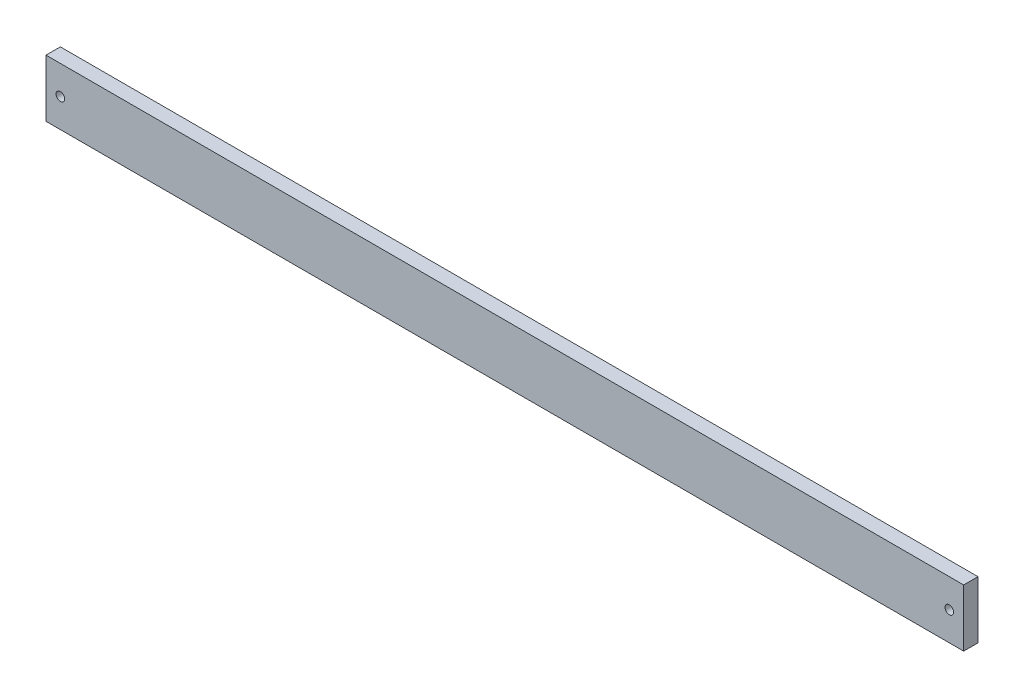
ISO-10303-21;
HEADER;
FILE_DESCRIPTION(('STEP AP214'),'2;1');
FILE_NAME('part.step','',(''),(''),'','','');
FILE_SCHEMA(('AUTOMOTIVE_DESIGN { 1 0 10303 214 1 1 1 1 }'));
ENDSEC;
DATA;
#1=APPLICATION_CONTEXT('core data for automotive mechanical design processes');
#2=APPLICATION_PROTOCOL_DEFINITION('international standard','automotive_design',2000,#1);
#3=PRODUCT_CONTEXT('',#1,'mechanical');
#4=PRODUCT('Part','Part','',(#3));
#5=PRODUCT_RELATED_PRODUCT_CATEGORY('part','',(#4));
#6=PRODUCT_DEFINITION_FORMATION('','',#4);
#7=PRODUCT_DEFINITION_CONTEXT('part definition',#1,'design');
#8=PRODUCT_DEFINITION('design','',#6,#7);
#9=PRODUCT_DEFINITION_SHAPE('','',#8);
#10=(LENGTH_UNIT() NAMED_UNIT(*) SI_UNIT(.MILLI.,.METRE.));
#11=(NAMED_UNIT(*) PLANE_ANGLE_UNIT() SI_UNIT($,.RADIAN.));
#12=(NAMED_UNIT(*) SI_UNIT($,.STERADIAN.) SOLID_ANGLE_UNIT());
#13=UNCERTAINTY_MEASURE_WITH_UNIT(LENGTH_MEASURE(1.E-05),#10,'distance_accuracy_value','');
#14=(GEOMETRIC_REPRESENTATION_CONTEXT(3) GLOBAL_UNCERTAINTY_ASSIGNED_CONTEXT((#13)) GLOBAL_UNIT_ASSIGNED_CONTEXT((#10,
#11,#12)) REPRESENTATION_CONTEXT('',''));
#15=CARTESIAN_POINT('',(0.,0.,0.));
#16=DIRECTION('',(0.,0.,1.));
#17=DIRECTION('',(1.,0.,0.));
#18=AXIS2_PLACEMENT_3D('',#15,#16,#17);
#19=CARTESIAN_POINT('',(-160.,-10.,5.));
#20=DIRECTION('',(1.,0.,0.));
#21=DIRECTION('',(0.,0.,-1.));
#22=AXIS2_PLACEMENT_3D('',#19,#20,#21);
#23=PLANE('',#22);
#24=DIRECTION('',(0.,-1.,0.));
#25=VECTOR('',#24,1.);
#26=CARTESIAN_POINT('',(-160.,-10.,0.));
#27=LINE('',#26,#25);
#28=CARTESIAN_POINT('',(-160.,9.99999999999998,0.));
#29=VERTEX_POINT('',#28);
#30=CARTESIAN_POINT('',(-160.,-10.,0.));
#31=VERTEX_POINT('',#30);
#32=EDGE_CURVE('E96',#29,#31,#27,.T.);
#33=ORIENTED_EDGE('',*,*,#32,.T.);
#34=DIRECTION('',(0.,0.,-1.));
#35=VECTOR('',#34,1.);
#36=CARTESIAN_POINT('',(-160.,-10.,5.));
#37=LINE('',#36,#35);
#38=CARTESIAN_POINT('',(-160.,-10.,5.));
#39=VERTEX_POINT('',#38);
#40=EDGE_CURVE('E11',#39,#31,#37,.T.);
#41=ORIENTED_EDGE('',*,*,#40,.F.);
#42=DIRECTION('',(0.,-1.,0.));
#43=VECTOR('',#42,1.);
#44=CARTESIAN_POINT('',(-160.,-10.,5.));
#45=LINE('',#44,#43);
#46=CARTESIAN_POINT('',(-160.,9.99999999999998,5.));
#47=VERTEX_POINT('',#46);
#48=EDGE_CURVE('E84',#47,#39,#45,.T.);
#49=ORIENTED_EDGE('',*,*,#48,.F.);
#50=DIRECTION('',(0.,0.,-1.));
#51=VECTOR('',#50,1.);
#52=CARTESIAN_POINT('',(-160.,9.99999999999998,5.));
#53=LINE('',#52,#51);
#54=EDGE_CURVE('E92',#47,#29,#53,.T.);
#55=ORIENTED_EDGE('',*,*,#54,.T.);
#56=EDGE_LOOP('',(#33,#41,#49,#55));
#57=FACE_BOUND('',#56,.T.);
#58=ADVANCED_FACE('F33',(#57),#23,.F.);
#59=CARTESIAN_POINT('',(160.,-9.99999999999998,5.));
#60=DIRECTION('',(0.,1.,0.));
#61=DIRECTION('',(-1.,0.,0.));
#62=AXIS2_PLACEMENT_3D('',#59,#60,#61);
#63=PLANE('',#62);
#64=DIRECTION('',(1.,0.,0.));
#65=VECTOR('',#64,1.);
#66=CARTESIAN_POINT('',(160.,-9.99999999999998,0.));
#67=LINE('',#66,#65);
#68=CARTESIAN_POINT('',(160.,-9.99999999999998,0.));
#69=VERTEX_POINT('',#68);
#70=EDGE_CURVE('E88',#31,#69,#67,.T.);
#71=ORIENTED_EDGE('',*,*,#70,.T.);
#72=DIRECTION('',(0.,0.,-1.));
#73=VECTOR('',#72,1.);
#74=CARTESIAN_POINT('',(160.,-9.99999999999998,5.));
#75=LINE('',#74,#73);
#76=CARTESIAN_POINT('',(160.,-9.99999999999998,5.));
#77=VERTEX_POINT('',#76);
#78=EDGE_CURVE('E41',#77,#69,#75,.T.);
#79=ORIENTED_EDGE('',*,*,#78,.F.);
#80=DIRECTION('',(1.,0.,0.));
#81=VECTOR('',#80,1.);
#82=CARTESIAN_POINT('',(160.,-9.99999999999998,5.));
#83=LINE('',#82,#81);
#84=EDGE_CURVE('E79',#39,#77,#83,.T.);
#85=ORIENTED_EDGE('',*,*,#84,.F.);
#86=ORIENTED_EDGE('',*,*,#40,.T.);
#87=EDGE_LOOP('',(#71,#79,#85,#86));
#88=FACE_BOUND('',#87,.T.);
#89=ADVANCED_FACE('F87',(#88),#63,.F.);
#90=CARTESIAN_POINT('',(160.,-9.99999999999998,5.));
#91=DIRECTION('',(-1.,0.,0.));
#92=DIRECTION('',(0.,0.,1.));
#93=AXIS2_PLACEMENT_3D('',#90,#91,#92);
#94=PLANE('',#93);
#95=DIRECTION('',(0.,1.,0.));
#96=VECTOR('',#95,1.);
#97=CARTESIAN_POINT('',(160.,-9.99999999999998,0.));
#98=LINE('',#97,#96);
#99=CARTESIAN_POINT('',(160.,10.,0.));
#100=VERTEX_POINT('',#99);
#101=EDGE_CURVE('E66',#69,#100,#98,.T.);
#102=ORIENTED_EDGE('',*,*,#101,.T.);
#103=DIRECTION('',(0.,0.,-1.));
#104=VECTOR('',#103,1.);
#105=CARTESIAN_POINT('',(160.,10.,5.));
#106=LINE('',#105,#104);
#107=CARTESIAN_POINT('',(160.,10.,5.));
#108=VERTEX_POINT('',#107);
#109=EDGE_CURVE('E89',#108,#100,#106,.T.);
#110=ORIENTED_EDGE('',*,*,#109,.F.);
#111=DIRECTION('',(0.,1.,0.));
#112=VECTOR('',#111,1.);
#113=CARTESIAN_POINT('',(160.,-9.99999999999998,5.));
#114=LINE('',#113,#112);
#115=EDGE_CURVE('E82',#77,#108,#114,.T.);
#116=ORIENTED_EDGE('',*,*,#115,.F.);
#117=ORIENTED_EDGE('',*,*,#78,.T.);
#118=EDGE_LOOP('',(#102,#110,#116,#117));
#119=FACE_BOUND('',#118,.T.);
#120=ADVANCED_FACE('F90',(#119),#94,.F.);
#121=CARTESIAN_POINT('',(160.,10.,5.));
#122=DIRECTION('',(0.,-1.,0.));
#123=DIRECTION('',(1.,0.,0.));
#124=AXIS2_PLACEMENT_3D('',#121,#122,#123);
#125=PLANE('',#124);
#126=DIRECTION('',(-1.,0.,0.));
#127=VECTOR('',#126,1.);
#128=CARTESIAN_POINT('',(160.,10.,0.));
#129=LINE('',#128,#127);
#130=EDGE_CURVE('E72',#100,#29,#129,.T.);
#131=ORIENTED_EDGE('',*,*,#130,.T.);
#132=ORIENTED_EDGE('',*,*,#54,.F.);
#133=DIRECTION('',(-1.,0.,0.));
#134=VECTOR('',#133,1.);
#135=CARTESIAN_POINT('',(160.,10.,5.));
#136=LINE('',#135,#134);
#137=EDGE_CURVE('E49',#108,#47,#136,.T.);
#138=ORIENTED_EDGE('',*,*,#137,.F.);
#139=ORIENTED_EDGE('',*,*,#109,.T.);
#140=EDGE_LOOP('',(#131,#132,#138,#139));
#141=FACE_BOUND('',#140,.T.);
#142=ADVANCED_FACE('F104',(#141),#125,.F.);
#143=CARTESIAN_POINT('',(0.,0.,5.));
#144=DIRECTION('',(0.,0.,1.));
#145=DIRECTION('',(1.,0.,0.));
#146=AXIS2_PLACEMENT_3D('',#143,#144,#145);
#147=PLANE('',#146);
#148=CARTESIAN_POINT('',(155.,0.,5.));
#149=DIRECTION('',(0.,0.,1.));
#150=DIRECTION('',(-1.,0.,0.));
#151=AXIS2_PLACEMENT_3D('',#148,#149,#150);
#152=CIRCLE('',#151,1.50000000000124);
#153=CARTESIAN_POINT('',(153.499999999999,0.,5.));
#154=VERTEX_POINT('',#153);
#155=EDGE_CURVE('E116',#154,#154,#152,.T.);
#156=ORIENTED_EDGE('',*,*,#155,.F.);
#157=EDGE_LOOP('',(#156));
#158=FACE_BOUND('',#157,.T.);
#159=CARTESIAN_POINT('',(-155.,0.,5.));
#160=DIRECTION('',(0.,0.,1.));
#161=DIRECTION('',(1.,0.,0.));
#162=AXIS2_PLACEMENT_3D('',#159,#160,#161);
#163=CIRCLE('',#162,1.5);
#164=CARTESIAN_POINT('',(-153.5,0.,5.));
#165=VERTEX_POINT('',#164);
#166=EDGE_CURVE('E110',#165,#165,#163,.T.);
#167=ORIENTED_EDGE('',*,*,#166,.F.);
#168=EDGE_LOOP('',(#167));
#169=FACE_BOUND('',#168,.T.);
#170=ORIENTED_EDGE('',*,*,#48,.T.);
#171=ORIENTED_EDGE('',*,*,#84,.T.);
#172=ORIENTED_EDGE('',*,*,#115,.T.);
#173=ORIENTED_EDGE('',*,*,#137,.T.);
#174=EDGE_LOOP('',(#170,#171,#172,#173));
#175=FACE_BOUND('',#174,.T.);
#176=ADVANCED_FACE('F80',(#158,#169,#175),#147,.T.);
#177=CARTESIAN_POINT('',(0.,0.,0.));
#178=DIRECTION('',(0.,0.,1.));
#179=DIRECTION('',(1.,0.,0.));
#180=AXIS2_PLACEMENT_3D('',#177,#178,#179);
#181=PLANE('',#180);
#182=CARTESIAN_POINT('',(155.,0.,0.));
#183=DIRECTION('',(0.,0.,1.));
#184=DIRECTION('',(-1.,0.,0.));
#185=AXIS2_PLACEMENT_3D('',#182,#183,#184);
#186=CIRCLE('',#185,1.50000000000124);
#187=CARTESIAN_POINT('',(153.499999999999,0.,0.));
#188=VERTEX_POINT('',#187);
#189=EDGE_CURVE('E113',#188,#188,#186,.T.);
#190=ORIENTED_EDGE('',*,*,#189,.T.);
#191=EDGE_LOOP('',(#190));
#192=FACE_BOUND('',#191,.T.);
#193=CARTESIAN_POINT('',(-155.,0.,0.));
#194=DIRECTION('',(0.,0.,1.));
#195=DIRECTION('',(1.,0.,0.));
#196=AXIS2_PLACEMENT_3D('',#193,#194,#195);
#197=CIRCLE('',#196,1.5);
#198=CARTESIAN_POINT('',(-153.5,0.,0.));
#199=VERTEX_POINT('',#198);
#200=EDGE_CURVE('E99',#199,#199,#197,.T.);
#201=ORIENTED_EDGE('',*,*,#200,.T.);
#202=EDGE_LOOP('',(#201));
#203=FACE_BOUND('',#202,.T.);
#204=ORIENTED_EDGE('',*,*,#32,.F.);
#205=ORIENTED_EDGE('',*,*,#130,.F.);
#206=ORIENTED_EDGE('',*,*,#101,.F.);
#207=ORIENTED_EDGE('',*,*,#70,.F.);
#208=EDGE_LOOP('',(#204,#205,#206,#207));
#209=FACE_BOUND('',#208,.T.);
#210=ADVANCED_FACE('F107',(#192,#203,#209),#181,.F.);
#211=CARTESIAN_POINT('',(-155.,0.,0.));
#212=DIRECTION('',(0.,0.,1.));
#213=DIRECTION('',(1.,0.,0.));
#214=AXIS2_PLACEMENT_3D('',#211,#212,#213);
#215=CYLINDRICAL_SURFACE('',#214,1.5);
#216=ORIENTED_EDGE('',*,*,#200,.F.);
#217=EDGE_LOOP('',(#216));
#218=FACE_BOUND('',#217,.T.);
#219=ORIENTED_EDGE('',*,*,#166,.T.);
#220=EDGE_LOOP('',(#219));
#221=FACE_BOUND('',#220,.T.);
#222=ADVANCED_FACE('F127',(#218,#221),#215,.F.);
#223=CARTESIAN_POINT('',(155.,0.,0.));
#224=DIRECTION('',(0.,0.,1.));
#225=DIRECTION('',(1.,0.,0.));
#226=AXIS2_PLACEMENT_3D('',#223,#224,#225);
#227=CYLINDRICAL_SURFACE('',#226,1.50000000000124);
#228=ORIENTED_EDGE('',*,*,#189,.F.);
#229=EDGE_LOOP('',(#228));
#230=FACE_BOUND('',#229,.T.);
#231=ORIENTED_EDGE('',*,*,#155,.T.);
#232=EDGE_LOOP('',(#231));
#233=FACE_BOUND('',#232,.T.);
#234=ADVANCED_FACE('F124',(#230,#233),#227,.F.);
#235=CLOSED_SHELL('',(#58,#89,#120,#142,#176,#210,#222,#234));
#236=MANIFOLD_SOLID_BREP('B2',#235);
#237=ADVANCED_BREP_SHAPE_REPRESENTATION('',(#18,#236),#14);
#238=SHAPE_DEFINITION_REPRESENTATION(#9,#237);
ENDSEC;
END-ISO-10303-21;
